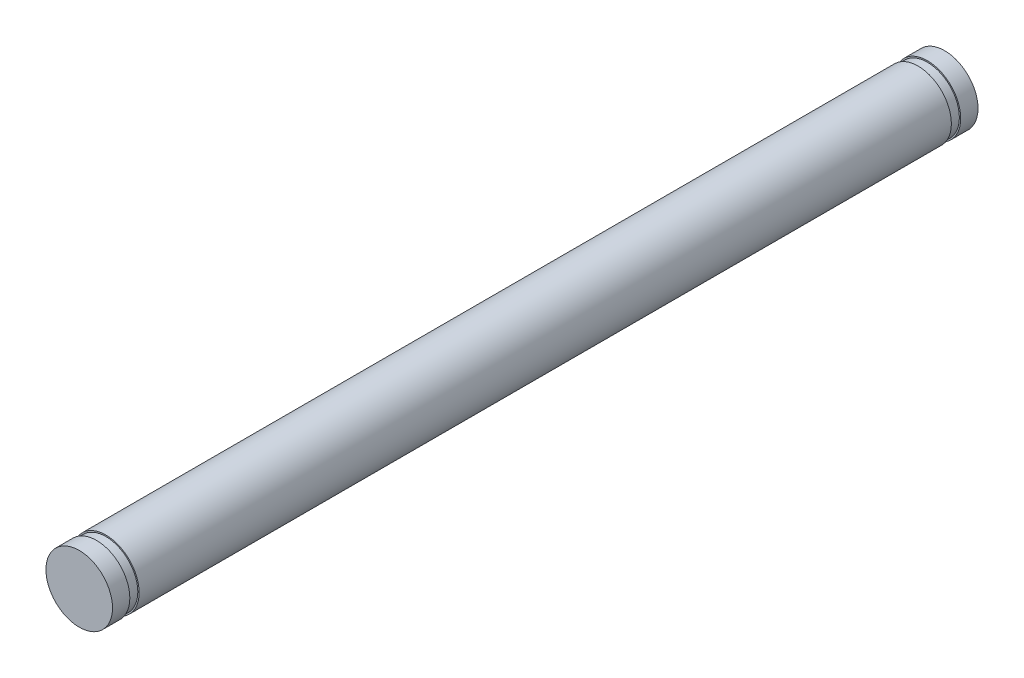
ISO-10303-21;
HEADER;
FILE_DESCRIPTION(('STEP AP214'),'2;1');
FILE_NAME('part.step','',(''),(''),'','','');
FILE_SCHEMA(('AUTOMOTIVE_DESIGN { 1 0 10303 214 1 1 1 1 }'));
ENDSEC;
DATA;
#1=APPLICATION_CONTEXT('core data for automotive mechanical design processes');
#2=APPLICATION_PROTOCOL_DEFINITION('international standard','automotive_design',2000,#1);
#3=PRODUCT_CONTEXT('',#1,'mechanical');
#4=PRODUCT('Part','Part','',(#3));
#5=PRODUCT_RELATED_PRODUCT_CATEGORY('part','',(#4));
#6=PRODUCT_DEFINITION_FORMATION('','',#4);
#7=PRODUCT_DEFINITION_CONTEXT('part definition',#1,'design');
#8=PRODUCT_DEFINITION('design','',#6,#7);
#9=PRODUCT_DEFINITION_SHAPE('','',#8);
#10=(LENGTH_UNIT() NAMED_UNIT(*) SI_UNIT(.MILLI.,.METRE.));
#11=(NAMED_UNIT(*) PLANE_ANGLE_UNIT() SI_UNIT($,.RADIAN.));
#12=(NAMED_UNIT(*) SI_UNIT($,.STERADIAN.) SOLID_ANGLE_UNIT());
#13=UNCERTAINTY_MEASURE_WITH_UNIT(LENGTH_MEASURE(1.E-05),#10,'distance_accuracy_value','');
#14=(GEOMETRIC_REPRESENTATION_CONTEXT(3) GLOBAL_UNCERTAINTY_ASSIGNED_CONTEXT((#13)) GLOBAL_UNIT_ASSIGNED_CONTEXT((#10,
#11,#12)) REPRESENTATION_CONTEXT('',''));
#15=CARTESIAN_POINT('',(0.,0.,0.));
#16=DIRECTION('',(0.,0.,1.));
#17=DIRECTION('',(1.,0.,0.));
#18=AXIS2_PLACEMENT_3D('',#15,#16,#17);
#19=CARTESIAN_POINT('',(0.,0.,32.5));
#20=DIRECTION('',(0.,0.,1.));
#21=DIRECTION('',(1.,0.,0.));
#22=AXIS2_PLACEMENT_3D('',#19,#20,#21);
#23=PLANE('',#22);
#24=CARTESIAN_POINT('',(0.,0.,32.5));
#25=DIRECTION('',(0.,0.,1.));
#26=DIRECTION('',(1.,0.,0.));
#27=AXIS2_PLACEMENT_3D('',#24,#25,#26);
#28=CIRCLE('',#27,2.5);
#29=CARTESIAN_POINT('',(2.5,0.,32.5));
#30=VERTEX_POINT('',#29);
#31=EDGE_CURVE('E10',#30,#30,#28,.T.);
#32=ORIENTED_EDGE('',*,*,#31,.T.);
#33=EDGE_LOOP('',(#32));
#34=FACE_BOUND('',#33,.T.);
#35=ADVANCED_FACE('F32',(#34),#23,.T.);
#36=CARTESIAN_POINT('',(0.,0.,32.5));
#37=DIRECTION('',(0.,0.,1.));
#38=DIRECTION('',(1.,0.,0.));
#39=AXIS2_PLACEMENT_3D('',#36,#37,#38);
#40=CYLINDRICAL_SURFACE('',#39,2.5);
#41=CARTESIAN_POINT('',(0.,0.,31.2));
#42=DIRECTION('',(0.,0.,1.));
#43=DIRECTION('',(1.,0.,0.));
#44=AXIS2_PLACEMENT_3D('',#41,#42,#43);
#45=CIRCLE('',#44,2.5);
#46=CARTESIAN_POINT('',(2.5,0.,31.2));
#47=VERTEX_POINT('',#46);
#48=EDGE_CURVE('E38',#47,#47,#45,.T.);
#49=ORIENTED_EDGE('',*,*,#48,.T.);
#50=EDGE_LOOP('',(#49));
#51=FACE_BOUND('',#50,.T.);
#52=ORIENTED_EDGE('',*,*,#31,.F.);
#53=EDGE_LOOP('',(#52));
#54=FACE_BOUND('',#53,.T.);
#55=ADVANCED_FACE('F82',(#51,#54),#40,.T.);
#56=CARTESIAN_POINT('',(0.,-2.5,31.2));
#57=DIRECTION('',(0.,0.,-1.));
#58=DIRECTION('',(-1.,0.,0.));
#59=AXIS2_PLACEMENT_3D('',#56,#57,#58);
#60=PLANE('',#59);
#61=CARTESIAN_POINT('',(0.,0.,31.2));
#62=DIRECTION('',(0.,0.,1.));
#63=DIRECTION('',(1.,0.,0.));
#64=AXIS2_PLACEMENT_3D('',#61,#62,#63);
#65=CIRCLE('',#64,2.4);
#66=CARTESIAN_POINT('',(2.4,0.,31.2));
#67=VERTEX_POINT('',#66);
#68=EDGE_CURVE('E42',#67,#67,#65,.T.);
#69=ORIENTED_EDGE('',*,*,#68,.T.);
#70=EDGE_LOOP('',(#69));
#71=FACE_BOUND('',#70,.T.);
#72=ORIENTED_EDGE('',*,*,#48,.F.);
#73=EDGE_LOOP('',(#72));
#74=FACE_BOUND('',#73,.T.);
#75=ADVANCED_FACE('F86',(#71,#74),#60,.T.);
#76=CARTESIAN_POINT('',(0.,0.,32.5));
#77=DIRECTION('',(0.,0.,1.));
#78=DIRECTION('',(1.,0.,0.));
#79=AXIS2_PLACEMENT_3D('',#76,#77,#78);
#80=CYLINDRICAL_SURFACE('',#79,2.4);
#81=CARTESIAN_POINT('',(0.,0.,30.5));
#82=DIRECTION('',(0.,0.,1.));
#83=DIRECTION('',(1.,0.,0.));
#84=AXIS2_PLACEMENT_3D('',#81,#82,#83);
#85=CIRCLE('',#84,2.4);
#86=CARTESIAN_POINT('',(2.4,0.,30.5));
#87=VERTEX_POINT('',#86);
#88=EDGE_CURVE('E46',#87,#87,#85,.T.);
#89=ORIENTED_EDGE('',*,*,#88,.T.);
#90=EDGE_LOOP('',(#89));
#91=FACE_BOUND('',#90,.T.);
#92=ORIENTED_EDGE('',*,*,#68,.F.);
#93=EDGE_LOOP('',(#92));
#94=FACE_BOUND('',#93,.T.);
#95=ADVANCED_FACE('F90',(#91,#94),#80,.T.);
#96=CARTESIAN_POINT('',(0.,-2.4,30.5));
#97=DIRECTION('',(0.,0.,1.));
#98=DIRECTION('',(1.,0.,0.));
#99=AXIS2_PLACEMENT_3D('',#96,#97,#98);
#100=PLANE('',#99);
#101=CARTESIAN_POINT('',(0.,0.,30.5));
#102=DIRECTION('',(0.,0.,1.));
#103=DIRECTION('',(1.,0.,0.));
#104=AXIS2_PLACEMENT_3D('',#101,#102,#103);
#105=CIRCLE('',#104,2.5);
#106=CARTESIAN_POINT('',(2.5,0.,30.5));
#107=VERTEX_POINT('',#106);
#108=EDGE_CURVE('E51',#107,#107,#105,.T.);
#109=ORIENTED_EDGE('',*,*,#108,.T.);
#110=EDGE_LOOP('',(#109));
#111=FACE_BOUND('',#110,.T.);
#112=ORIENTED_EDGE('',*,*,#88,.F.);
#113=EDGE_LOOP('',(#112));
#114=FACE_BOUND('',#113,.T.);
#115=ADVANCED_FACE('F97',(#111,#114),#100,.T.);
#116=CARTESIAN_POINT('',(0.,0.,32.5));
#117=DIRECTION('',(0.,0.,1.));
#118=DIRECTION('',(1.,0.,0.));
#119=AXIS2_PLACEMENT_3D('',#116,#117,#118);
#120=CYLINDRICAL_SURFACE('',#119,2.5);
#121=CARTESIAN_POINT('',(0.,0.,-30.5));
#122=DIRECTION('',(0.,0.,1.));
#123=DIRECTION('',(1.,0.,0.));
#124=AXIS2_PLACEMENT_3D('',#121,#122,#123);
#125=CIRCLE('',#124,2.49999999999999);
#126=CARTESIAN_POINT('',(2.49999999999999,0.,-30.5));
#127=VERTEX_POINT('',#126);
#128=EDGE_CURVE('E54',#127,#127,#125,.T.);
#129=ORIENTED_EDGE('',*,*,#128,.T.);
#130=EDGE_LOOP('',(#129));
#131=FACE_BOUND('',#130,.T.);
#132=ORIENTED_EDGE('',*,*,#108,.F.);
#133=EDGE_LOOP('',(#132));
#134=FACE_BOUND('',#133,.T.);
#135=ADVANCED_FACE('F101',(#131,#134),#120,.T.);
#136=CARTESIAN_POINT('',(0.,-2.39999999999999,-30.5));
#137=DIRECTION('',(0.,0.,-1.));
#138=DIRECTION('',(-1.,0.,0.));
#139=AXIS2_PLACEMENT_3D('',#136,#137,#138);
#140=PLANE('',#139);
#141=CARTESIAN_POINT('',(0.,0.,-30.5));
#142=DIRECTION('',(0.,0.,1.));
#143=DIRECTION('',(1.,0.,0.));
#144=AXIS2_PLACEMENT_3D('',#141,#142,#143);
#145=CIRCLE('',#144,2.39999999999999);
#146=CARTESIAN_POINT('',(2.39999999999999,0.,-30.5));
#147=VERTEX_POINT('',#146);
#148=EDGE_CURVE('E57',#147,#147,#145,.T.);
#149=ORIENTED_EDGE('',*,*,#148,.T.);
#150=EDGE_LOOP('',(#149));
#151=FACE_BOUND('',#150,.T.);
#152=ORIENTED_EDGE('',*,*,#128,.F.);
#153=EDGE_LOOP('',(#152));
#154=FACE_BOUND('',#153,.T.);
#155=ADVANCED_FACE('F105',(#151,#154),#140,.T.);
#156=CARTESIAN_POINT('',(0.,0.,32.5));
#157=DIRECTION('',(0.,0.,1.));
#158=DIRECTION('',(1.,0.,0.));
#159=AXIS2_PLACEMENT_3D('',#156,#157,#158);
#160=CYLINDRICAL_SURFACE('',#159,2.39999999999999);
#161=CARTESIAN_POINT('',(0.,0.,-31.2));
#162=DIRECTION('',(0.,0.,1.));
#163=DIRECTION('',(1.,0.,0.));
#164=AXIS2_PLACEMENT_3D('',#161,#162,#163);
#165=CIRCLE('',#164,2.39999999999999);
#166=CARTESIAN_POINT('',(2.39999999999999,0.,-31.2));
#167=VERTEX_POINT('',#166);
#168=EDGE_CURVE('E60',#167,#167,#165,.T.);
#169=ORIENTED_EDGE('',*,*,#168,.T.);
#170=EDGE_LOOP('',(#169));
#171=FACE_BOUND('',#170,.T.);
#172=ORIENTED_EDGE('',*,*,#148,.F.);
#173=EDGE_LOOP('',(#172));
#174=FACE_BOUND('',#173,.T.);
#175=ADVANCED_FACE('F109',(#171,#174),#160,.T.);
#176=CARTESIAN_POINT('',(0.,-2.49999999999999,-31.2));
#177=DIRECTION('',(0.,0.,1.));
#178=DIRECTION('',(1.,0.,0.));
#179=AXIS2_PLACEMENT_3D('',#176,#177,#178);
#180=PLANE('',#179);
#181=CARTESIAN_POINT('',(0.,0.,-31.2));
#182=DIRECTION('',(0.,0.,1.));
#183=DIRECTION('',(1.,0.,0.));
#184=AXIS2_PLACEMENT_3D('',#181,#182,#183);
#185=CIRCLE('',#184,2.49999999999999);
#186=CARTESIAN_POINT('',(2.49999999999999,0.,-31.2));
#187=VERTEX_POINT('',#186);
#188=EDGE_CURVE('E63',#187,#187,#185,.T.);
#189=ORIENTED_EDGE('',*,*,#188,.T.);
#190=EDGE_LOOP('',(#189));
#191=FACE_BOUND('',#190,.T.);
#192=ORIENTED_EDGE('',*,*,#168,.F.);
#193=EDGE_LOOP('',(#192));
#194=FACE_BOUND('',#193,.T.);
#195=ADVANCED_FACE('F79',(#191,#194),#180,.T.);
#196=CARTESIAN_POINT('',(0.,0.,32.5));
#197=DIRECTION('',(0.,0.,1.));
#198=DIRECTION('',(1.,0.,0.));
#199=AXIS2_PLACEMENT_3D('',#196,#197,#198);
#200=CYLINDRICAL_SURFACE('',#199,2.5);
#201=CARTESIAN_POINT('',(0.,0.,-32.5));
#202=DIRECTION('',(0.,0.,1.));
#203=DIRECTION('',(1.,0.,0.));
#204=AXIS2_PLACEMENT_3D('',#201,#202,#203);
#205=CIRCLE('',#204,2.5);
#206=CARTESIAN_POINT('',(2.5,0.,-32.5));
#207=VERTEX_POINT('',#206);
#208=EDGE_CURVE('E66',#207,#207,#205,.T.);
#209=ORIENTED_EDGE('',*,*,#208,.T.);
#210=EDGE_LOOP('',(#209));
#211=FACE_BOUND('',#210,.T.);
#212=ORIENTED_EDGE('',*,*,#188,.F.);
#213=EDGE_LOOP('',(#212));
#214=FACE_BOUND('',#213,.T.);
#215=ADVANCED_FACE('F70',(#211,#214),#200,.T.);
#216=CARTESIAN_POINT('',(0.,0.,-32.5));
#217=DIRECTION('',(0.,0.,-1.));
#218=DIRECTION('',(-1.,0.,0.));
#219=AXIS2_PLACEMENT_3D('',#216,#217,#218);
#220=PLANE('',#219);
#221=ORIENTED_EDGE('',*,*,#208,.F.);
#222=EDGE_LOOP('',(#221));
#223=FACE_BOUND('',#222,.T.);
#224=ADVANCED_FACE('F73',(#223),#220,.T.);
#225=CLOSED_SHELL('',(#35,#55,#75,#95,#115,#135,#155,#175,#195,#215,#224));
#226=MANIFOLD_SOLID_BREP('B2',#225);
#227=ADVANCED_BREP_SHAPE_REPRESENTATION('',(#18,#226),#14);
#228=SHAPE_DEFINITION_REPRESENTATION(#9,#227);
ENDSEC;
END-ISO-10303-21;
